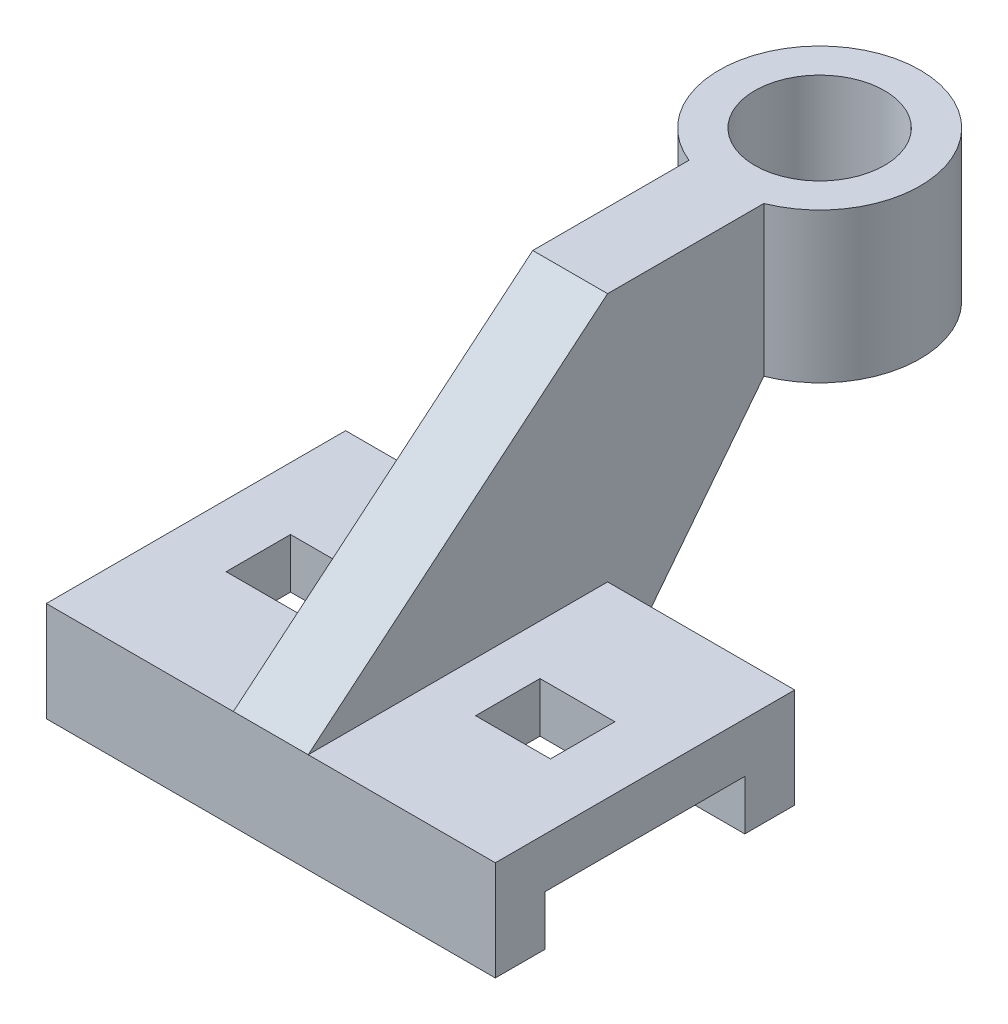
ISO-10303-21;
HEADER;
FILE_DESCRIPTION(('STEP AP214'),'2;1');
FILE_NAME('part.step','',(''),(''),'','','');
FILE_SCHEMA(('AUTOMOTIVE_DESIGN { 1 0 10303 214 1 1 1 1 }'));
ENDSEC;
DATA;
#1=APPLICATION_CONTEXT('core data for automotive mechanical design processes');
#2=APPLICATION_PROTOCOL_DEFINITION('international standard','automotive_design',2000,#1);
#3=PRODUCT_CONTEXT('',#1,'mechanical');
#4=PRODUCT('Part','Part','',(#3));
#5=PRODUCT_RELATED_PRODUCT_CATEGORY('part','',(#4));
#6=PRODUCT_DEFINITION_FORMATION('','',#4);
#7=PRODUCT_DEFINITION_CONTEXT('part definition',#1,'design');
#8=PRODUCT_DEFINITION('design','',#6,#7);
#9=PRODUCT_DEFINITION_SHAPE('','',#8);
#10=(LENGTH_UNIT() NAMED_UNIT(*) SI_UNIT(.MILLI.,.METRE.));
#11=(NAMED_UNIT(*) PLANE_ANGLE_UNIT() SI_UNIT($,.RADIAN.));
#12=(NAMED_UNIT(*) SI_UNIT($,.STERADIAN.) SOLID_ANGLE_UNIT());
#13=UNCERTAINTY_MEASURE_WITH_UNIT(LENGTH_MEASURE(1.E-05),#10,'distance_accuracy_value','');
#14=(GEOMETRIC_REPRESENTATION_CONTEXT(3) GLOBAL_UNCERTAINTY_ASSIGNED_CONTEXT((#13)) GLOBAL_UNIT_ASSIGNED_CONTEXT((#10,
#11,#12)) REPRESENTATION_CONTEXT('',''));
#15=CARTESIAN_POINT('',(0.,0.,0.));
#16=DIRECTION('',(0.,0.,1.));
#17=DIRECTION('',(1.,0.,0.));
#18=AXIS2_PLACEMENT_3D('',#15,#16,#17);
#19=CARTESIAN_POINT('',(0.,0.,0.));
#20=DIRECTION('',(0.,0.,-1.));
#21=DIRECTION('',(-1.,0.,0.));
#22=AXIS2_PLACEMENT_3D('',#19,#20,#21);
#23=PLANE('',#22);
#24=DIRECTION('',(1.,0.,0.));
#25=VECTOR('',#24,1.);
#26=CARTESIAN_POINT('',(-39.3455497382199,0.,0.));
#27=LINE('',#26,#25);
#28=CARTESIAN_POINT('',(13.1544502617801,0.,0.));
#29=VERTEX_POINT('',#28);
#30=CARTESIAN_POINT('',(50.6544502617801,0.,0.));
#31=VERTEX_POINT('',#30);
#32=EDGE_CURVE('E223',#29,#31,#27,.T.);
#33=ORIENTED_EDGE('',*,*,#32,.F.);
#34=DIRECTION('',(0.,-1.,0.));
#35=VECTOR('',#34,1.);
#36=CARTESIAN_POINT('',(13.1544502617801,47.,0.));
#37=LINE('',#36,#35);
#38=CARTESIAN_POINT('',(13.1544502617801,20.,0.));
#39=VERTEX_POINT('',#38);
#40=EDGE_CURVE('E195',#39,#29,#37,.T.);
#41=ORIENTED_EDGE('',*,*,#40,.F.);
#42=DIRECTION('',(-1.,0.,0.));
#43=VECTOR('',#42,1.);
#44=CARTESIAN_POINT('',(-39.3455497382199,20.,0.));
#45=LINE('',#44,#43);
#46=CARTESIAN_POINT('',(50.6544502617801,20.,0.));
#47=VERTEX_POINT('',#46);
#48=EDGE_CURVE('E230',#47,#39,#45,.T.);
#49=ORIENTED_EDGE('',*,*,#48,.F.);
#50=DIRECTION('',(0.,1.,0.));
#51=VECTOR('',#50,1.);
#52=CARTESIAN_POINT('',(50.6544502617801,0.,0.));
#53=LINE('',#52,#51);
#54=EDGE_CURVE('E222',#31,#47,#53,.T.);
#55=ORIENTED_EDGE('',*,*,#54,.F.);
#56=EDGE_LOOP('',(#33,#41,#49,#55));
#57=FACE_BOUND('',#56,.T.);
#58=ADVANCED_FACE('F37',(#57),#23,.T.);
#59=CARTESIAN_POINT('',(-39.3455497382199,20.,60.));
#60=DIRECTION('',(0.,-1.,0.));
#61=DIRECTION('',(0.,0.,-1.));
#62=AXIS2_PLACEMENT_3D('',#59,#60,#61);
#63=PLANE('',#62);
#64=DIRECTION('',(0.,0.,1.));
#65=VECTOR('',#64,1.);
#66=CARTESIAN_POINT('',(-11.8455497382199,20.,0.));
#67=LINE('',#66,#65);
#68=CARTESIAN_POINT('',(-11.8455497382199,20.,23.5458731665562));
#69=VERTEX_POINT('',#68);
#70=CARTESIAN_POINT('',(-11.8455497382199,20.,36.4541268334439));
#71=VERTEX_POINT('',#70);
#72=EDGE_CURVE('E60',#69,#71,#67,.T.);
#73=ORIENTED_EDGE('',*,*,#72,.T.);
#74=DIRECTION('',(1.,0.,0.));
#75=VECTOR('',#74,1.);
#76=CARTESIAN_POINT('',(0.,20.,36.4541268334439));
#77=LINE('',#76,#75);
#78=CARTESIAN_POINT('',(-26.8455497382199,20.,36.4541268334439));
#79=VERTEX_POINT('',#78);
#80=EDGE_CURVE('E289',#79,#71,#77,.T.);
#81=ORIENTED_EDGE('',*,*,#80,.F.);
#82=DIRECTION('',(0.,0.,1.));
#83=VECTOR('',#82,1.);
#84=CARTESIAN_POINT('',(-26.8455497382199,20.,0.));
#85=LINE('',#84,#83);
#86=CARTESIAN_POINT('',(-26.8455497382199,20.,23.5458731665562));
#87=VERTEX_POINT('',#86);
#88=EDGE_CURVE('E286',#87,#79,#85,.T.);
#89=ORIENTED_EDGE('',*,*,#88,.F.);
#90=DIRECTION('',(1.,0.,0.));
#91=VECTOR('',#90,1.);
#92=CARTESIAN_POINT('',(0.,20.,23.5458731665562));
#93=LINE('',#92,#91);
#94=EDGE_CURVE('E282',#87,#69,#93,.T.);
#95=ORIENTED_EDGE('',*,*,#94,.T.);
#96=EDGE_LOOP('',(#73,#81,#89,#95));
#97=FACE_BOUND('',#96,.T.);
#98=DIRECTION('',(0.,0.,1.));
#99=VECTOR('',#98,1.);
#100=CARTESIAN_POINT('',(-1.8455497382199,20.,-10.));
#101=LINE('',#100,#99);
#102=CARTESIAN_POINT('',(-1.84554973821992,20.,0.));
#103=VERTEX_POINT('',#102);
#104=CARTESIAN_POINT('',(-1.8455497382199,20.,60.));
#105=VERTEX_POINT('',#104);
#106=EDGE_CURVE('E268',#103,#105,#101,.T.);
#107=ORIENTED_EDGE('',*,*,#106,.F.);
#108=CARTESIAN_POINT('',(-39.3455497382199,20.,0.));
#109=VERTEX_POINT('',#108);
#110=EDGE_CURVE('E215',#103,#109,#45,.T.);
#111=ORIENTED_EDGE('',*,*,#110,.T.);
#112=DIRECTION('',(0.,0.,-1.));
#113=VECTOR('',#112,1.);
#114=CARTESIAN_POINT('',(-39.3455497382199,20.,60.));
#115=LINE('',#114,#113);
#116=CARTESIAN_POINT('',(-39.3455497382199,20.,60.));
#117=VERTEX_POINT('',#116);
#118=EDGE_CURVE('E234',#117,#109,#115,.T.);
#119=ORIENTED_EDGE('',*,*,#118,.F.);
#120=DIRECTION('',(-1.,0.,0.));
#121=VECTOR('',#120,1.);
#122=CARTESIAN_POINT('',(-39.3455497382199,20.,60.));
#123=LINE('',#122,#121);
#124=EDGE_CURVE('E351',#105,#117,#123,.T.);
#125=ORIENTED_EDGE('',*,*,#124,.F.);
#126=EDGE_LOOP('',(#107,#111,#119,#125));
#127=FACE_BOUND('',#126,.T.);
#128=ADVANCED_FACE('F362',(#97,#127),#63,.F.);
#129=DIRECTION('',(0.,0.,1.));
#130=VECTOR('',#129,1.);
#131=CARTESIAN_POINT('',(38.1544502617801,20.,0.));
#132=LINE('',#131,#130);
#133=CARTESIAN_POINT('',(38.1544502617801,20.,23.5458731665562));
#134=VERTEX_POINT('',#133);
#135=CARTESIAN_POINT('',(38.1544502617801,20.,36.4541268334439));
#136=VERTEX_POINT('',#135);
#137=EDGE_CURVE('E301',#134,#136,#132,.T.);
#138=ORIENTED_EDGE('',*,*,#137,.T.);
#139=DIRECTION('',(-1.,0.,0.));
#140=VECTOR('',#139,1.);
#141=CARTESIAN_POINT('',(0.,20.,36.4541268334439));
#142=LINE('',#141,#140);
#143=CARTESIAN_POINT('',(23.1544502617801,20.,36.4541268334439));
#144=VERTEX_POINT('',#143);
#145=EDGE_CURVE('E310',#136,#144,#142,.T.);
#146=ORIENTED_EDGE('',*,*,#145,.T.);
#147=DIRECTION('',(0.,0.,1.));
#148=VECTOR('',#147,1.);
#149=CARTESIAN_POINT('',(23.1544502617801,20.,0.));
#150=LINE('',#149,#148);
#151=CARTESIAN_POINT('',(23.1544502617801,20.,23.5458731665562));
#152=VERTEX_POINT('',#151);
#153=EDGE_CURVE('E307',#152,#144,#150,.T.);
#154=ORIENTED_EDGE('',*,*,#153,.F.);
#155=DIRECTION('',(-1.,0.,0.));
#156=VECTOR('',#155,1.);
#157=CARTESIAN_POINT('',(0.,20.,23.5458731665562));
#158=LINE('',#157,#156);
#159=EDGE_CURVE('E304',#134,#152,#158,.T.);
#160=ORIENTED_EDGE('',*,*,#159,.F.);
#161=EDGE_LOOP('',(#138,#146,#154,#160));
#162=FACE_BOUND('',#161,.T.);
#163=ORIENTED_EDGE('',*,*,#48,.T.);
#164=DIRECTION('',(0.,0.,1.));
#165=VECTOR('',#164,1.);
#166=CARTESIAN_POINT('',(13.1544502617801,20.,-10.));
#167=LINE('',#166,#165);
#168=CARTESIAN_POINT('',(13.1544502617801,20.,60.));
#169=VERTEX_POINT('',#168);
#170=EDGE_CURVE('E45',#39,#169,#167,.T.);
#171=ORIENTED_EDGE('',*,*,#170,.T.);
#172=CARTESIAN_POINT('',(50.6544502617801,20.,60.));
#173=VERTEX_POINT('',#172);
#174=EDGE_CURVE('E238',#173,#169,#123,.T.);
#175=ORIENTED_EDGE('',*,*,#174,.F.);
#176=DIRECTION('',(0.,0.,-1.));
#177=VECTOR('',#176,1.);
#178=CARTESIAN_POINT('',(50.6544502617801,20.,60.));
#179=LINE('',#178,#177);
#180=EDGE_CURVE('E237',#173,#47,#179,.T.);
#181=ORIENTED_EDGE('',*,*,#180,.T.);
#182=EDGE_LOOP('',(#163,#171,#175,#181));
#183=FACE_BOUND('',#182,.T.);
#184=ADVANCED_FACE('F377',(#162,#183),#63,.F.);
#185=CARTESIAN_POINT('',(-39.34554973822,10.,50.));
#186=DIRECTION('',(0.,-1.,0.));
#187=DIRECTION('',(0.,0.,-1.));
#188=AXIS2_PLACEMENT_3D('',#185,#186,#187);
#189=PLANE('',#188);
#190=DIRECTION('',(0.,0.,-1.));
#191=VECTOR('',#190,1.);
#192=CARTESIAN_POINT('',(50.6544502617801,10.,50.));
#193=LINE('',#192,#191);
#194=CARTESIAN_POINT('',(50.6544502617801,10.,50.));
#195=VERTEX_POINT('',#194);
#196=CARTESIAN_POINT('',(50.6544502617801,10.,10.));
#197=VERTEX_POINT('',#196);
#198=EDGE_CURVE('E295',#195,#197,#193,.T.);
#199=ORIENTED_EDGE('',*,*,#198,.F.);
#200=DIRECTION('',(1.,0.,0.));
#201=VECTOR('',#200,1.);
#202=CARTESIAN_POINT('',(-39.34554973822,10.,50.));
#203=LINE('',#202,#201);
#204=CARTESIAN_POINT('',(-39.34554973822,10.,50.));
#205=VERTEX_POINT('',#204);
#206=EDGE_CURVE('E329',#205,#195,#203,.T.);
#207=ORIENTED_EDGE('',*,*,#206,.F.);
#208=DIRECTION('',(0.,0.,-1.));
#209=VECTOR('',#208,1.);
#210=CARTESIAN_POINT('',(-39.34554973822,10.,50.));
#211=LINE('',#210,#209);
#212=CARTESIAN_POINT('',(-39.34554973822,10.,10.));
#213=VERTEX_POINT('',#212);
#214=EDGE_CURVE('E321',#205,#213,#211,.T.);
#215=ORIENTED_EDGE('',*,*,#214,.T.);
#216=DIRECTION('',(1.,0.,0.));
#217=VECTOR('',#216,1.);
#218=CARTESIAN_POINT('',(-39.34554973822,10.,10.));
#219=LINE('',#218,#217);
#220=EDGE_CURVE('E344',#213,#197,#219,.T.);
#221=ORIENTED_EDGE('',*,*,#220,.T.);
#222=EDGE_LOOP('',(#199,#207,#215,#221));
#223=FACE_BOUND('',#222,.T.);
#224=DIRECTION('',(1.,0.,0.));
#225=VECTOR('',#224,1.);
#226=CARTESIAN_POINT('',(-39.34554973822,10.,36.4541268334439));
#227=LINE('',#226,#225);
#228=CARTESIAN_POINT('',(23.1544502617801,10.,36.4541268334439));
#229=VERTEX_POINT('',#228);
#230=CARTESIAN_POINT('',(38.1544502617801,10.,36.4541268334439));
#231=VERTEX_POINT('',#230);
#232=EDGE_CURVE('E253',#229,#231,#227,.T.);
#233=ORIENTED_EDGE('',*,*,#232,.T.);
#234=DIRECTION('',(0.,0.,-1.));
#235=VECTOR('',#234,1.);
#236=CARTESIAN_POINT('',(38.1544502617801,10.,50.));
#237=LINE('',#236,#235);
#238=CARTESIAN_POINT('',(38.1544502617801,10.,23.5458731665562));
#239=VERTEX_POINT('',#238);
#240=EDGE_CURVE('E256',#231,#239,#237,.T.);
#241=ORIENTED_EDGE('',*,*,#240,.T.);
#242=DIRECTION('',(1.,0.,0.));
#243=VECTOR('',#242,1.);
#244=CARTESIAN_POINT('',(-39.34554973822,10.,23.5458731665562));
#245=LINE('',#244,#243);
#246=CARTESIAN_POINT('',(23.1544502617801,10.,23.5458731665562));
#247=VERTEX_POINT('',#246);
#248=EDGE_CURVE('E248',#247,#239,#245,.T.);
#249=ORIENTED_EDGE('',*,*,#248,.F.);
#250=DIRECTION('',(0.,0.,-1.));
#251=VECTOR('',#250,1.);
#252=CARTESIAN_POINT('',(23.1544502617801,10.,50.));
#253=LINE('',#252,#251);
#254=EDGE_CURVE('E250',#229,#247,#253,.T.);
#255=ORIENTED_EDGE('',*,*,#254,.F.);
#256=EDGE_LOOP('',(#233,#241,#249,#255));
#257=FACE_BOUND('',#256,.T.);
#258=DIRECTION('',(-1.,0.,0.));
#259=VECTOR('',#258,1.);
#260=CARTESIAN_POINT('',(-39.34554973822,10.,36.4541268334439));
#261=LINE('',#260,#259);
#262=CARTESIAN_POINT('',(-11.8455497382199,10.,36.4541268334439));
#263=VERTEX_POINT('',#262);
#264=CARTESIAN_POINT('',(-26.8455497382199,10.,36.4541268334439));
#265=VERTEX_POINT('',#264);
#266=EDGE_CURVE('E265',#263,#265,#261,.T.);
#267=ORIENTED_EDGE('',*,*,#266,.F.);
#268=DIRECTION('',(0.,0.,-1.));
#269=VECTOR('',#268,1.);
#270=CARTESIAN_POINT('',(-11.8455497382199,10.,50.));
#271=LINE('',#270,#269);
#272=CARTESIAN_POINT('',(-11.8455497382199,10.,23.5458731665562));
#273=VERTEX_POINT('',#272);
#274=EDGE_CURVE('E266',#263,#273,#271,.T.);
#275=ORIENTED_EDGE('',*,*,#274,.T.);
#276=DIRECTION('',(-1.,0.,0.));
#277=VECTOR('',#276,1.);
#278=CARTESIAN_POINT('',(-39.34554973822,10.,23.5458731665562));
#279=LINE('',#278,#277);
#280=CARTESIAN_POINT('',(-26.8455497382199,10.,23.5458731665562));
#281=VERTEX_POINT('',#280);
#282=EDGE_CURVE('E259',#273,#281,#279,.T.);
#283=ORIENTED_EDGE('',*,*,#282,.T.);
#284=DIRECTION('',(0.,0.,-1.));
#285=VECTOR('',#284,1.);
#286=CARTESIAN_POINT('',(-26.8455497382199,10.,50.));
#287=LINE('',#286,#285);
#288=EDGE_CURVE('E262',#265,#281,#287,.T.);
#289=ORIENTED_EDGE('',*,*,#288,.F.);
#290=EDGE_LOOP('',(#267,#275,#283,#289));
#291=FACE_BOUND('',#290,.T.);
#292=ADVANCED_FACE('F455',(#223,#257,#291),#189,.T.);
#293=CARTESIAN_POINT('',(-39.3455497382199,0.,60.));
#294=DIRECTION('',(0.,1.,0.));
#295=DIRECTION('',(0.,0.,1.));
#296=AXIS2_PLACEMENT_3D('',#293,#294,#295);
#297=PLANE('',#296);
#298=DIRECTION('',(1.,0.,0.));
#299=VECTOR('',#298,1.);
#300=CARTESIAN_POINT('',(-39.34554973822,0.,50.));
#301=LINE('',#300,#299);
#302=CARTESIAN_POINT('',(-39.34554973822,0.,50.));
#303=VERTEX_POINT('',#302);
#304=CARTESIAN_POINT('',(50.6544502617801,0.,50.));
#305=VERTEX_POINT('',#304);
#306=EDGE_CURVE('E339',#303,#305,#301,.T.);
#307=ORIENTED_EDGE('',*,*,#306,.T.);
#308=DIRECTION('',(0.,0.,-1.));
#309=VECTOR('',#308,1.);
#310=CARTESIAN_POINT('',(50.6544502617801,0.,60.));
#311=LINE('',#310,#309);
#312=CARTESIAN_POINT('',(50.6544502617801,0.,60.));
#313=VERTEX_POINT('',#312);
#314=EDGE_CURVE('E242',#313,#305,#311,.T.);
#315=ORIENTED_EDGE('',*,*,#314,.F.);
#316=DIRECTION('',(1.,0.,0.));
#317=VECTOR('',#316,1.);
#318=CARTESIAN_POINT('',(-39.3455497382199,0.,60.));
#319=LINE('',#318,#317);
#320=CARTESIAN_POINT('',(-39.3455497382199,0.,60.));
#321=VERTEX_POINT('',#320);
#322=EDGE_CURVE('E348',#321,#313,#319,.T.);
#323=ORIENTED_EDGE('',*,*,#322,.F.);
#324=DIRECTION('',(0.,0.,-1.));
#325=VECTOR('',#324,1.);
#326=CARTESIAN_POINT('',(-39.3455497382199,0.,60.));
#327=LINE('',#326,#325);
#328=EDGE_CURVE('E245',#321,#303,#327,.T.);
#329=ORIENTED_EDGE('',*,*,#328,.T.);
#330=EDGE_LOOP('',(#307,#315,#323,#329));
#331=FACE_BOUND('',#330,.T.);
#332=ADVANCED_FACE('F367',(#331),#297,.F.);
#333=CARTESIAN_POINT('',(-39.3455497382199,0.,60.));
#334=DIRECTION('',(1.,0.,0.));
#335=DIRECTION('',(0.,1.,0.));
#336=AXIS2_PLACEMENT_3D('',#333,#334,#335);
#337=PLANE('',#336);
#338=CARTESIAN_POINT('',(-39.34554973822,0.,10.));
#339=VERTEX_POINT('',#338);
#340=CARTESIAN_POINT('',(-39.3455497382199,0.,0.));
#341=VERTEX_POINT('',#340);
#342=EDGE_CURVE('E221',#339,#341,#327,.T.);
#343=ORIENTED_EDGE('',*,*,#342,.F.);
#344=DIRECTION('',(0.,1.,0.));
#345=VECTOR('',#344,1.);
#346=CARTESIAN_POINT('',(-39.34554973822,0.,10.));
#347=LINE('',#346,#345);
#348=EDGE_CURVE('E323',#339,#213,#347,.T.);
#349=ORIENTED_EDGE('',*,*,#348,.T.);
#350=ORIENTED_EDGE('',*,*,#214,.F.);
#351=DIRECTION('',(0.,1.,0.));
#352=VECTOR('',#351,1.);
#353=CARTESIAN_POINT('',(-39.34554973822,0.,50.));
#354=LINE('',#353,#352);
#355=EDGE_CURVE('E327',#303,#205,#354,.T.);
#356=ORIENTED_EDGE('',*,*,#355,.F.);
#357=ORIENTED_EDGE('',*,*,#328,.F.);
#358=DIRECTION('',(0.,-1.,0.));
#359=VECTOR('',#358,1.);
#360=CARTESIAN_POINT('',(-39.3455497382199,0.,60.));
#361=LINE('',#360,#359);
#362=EDGE_CURVE('E233',#117,#321,#361,.T.);
#363=ORIENTED_EDGE('',*,*,#362,.F.);
#364=ORIENTED_EDGE('',*,*,#118,.T.);
#365=DIRECTION('',(0.,-1.,0.));
#366=VECTOR('',#365,1.);
#367=CARTESIAN_POINT('',(-39.3455497382199,0.,0.));
#368=LINE('',#367,#366);
#369=EDGE_CURVE('E226',#109,#341,#368,.T.);
#370=ORIENTED_EDGE('',*,*,#369,.T.);
#371=EDGE_LOOP('',(#343,#349,#350,#356,#357,#363,#364,#370));
#372=FACE_BOUND('',#371,.T.);
#373=ADVANCED_FACE('F39',(#372),#337,.F.);
#374=CARTESIAN_POINT('',(-1.8455497382199,0.,0.));
#375=VERTEX_POINT('',#374);
#376=EDGE_CURVE('E213',#341,#375,#27,.T.);
#377=ORIENTED_EDGE('',*,*,#376,.T.);
#378=DIRECTION('',(1.,0.,0.));
#379=VECTOR('',#378,1.);
#380=CARTESIAN_POINT('',(-1.8455497382199,0.,0.));
#381=LINE('',#380,#379);
#382=EDGE_CURVE('E186',#375,#29,#381,.T.);
#383=ORIENTED_EDGE('',*,*,#382,.T.);
#384=ORIENTED_EDGE('',*,*,#32,.T.);
#385=CARTESIAN_POINT('',(50.6544502617801,0.,10.));
#386=VERTEX_POINT('',#385);
#387=EDGE_CURVE('E241',#386,#31,#311,.T.);
#388=ORIENTED_EDGE('',*,*,#387,.F.);
#389=DIRECTION('',(1.,0.,0.));
#390=VECTOR('',#389,1.);
#391=CARTESIAN_POINT('',(-39.34554973822,0.,10.));
#392=LINE('',#391,#390);
#393=EDGE_CURVE('E342',#339,#386,#392,.T.);
#394=ORIENTED_EDGE('',*,*,#393,.F.);
#395=ORIENTED_EDGE('',*,*,#342,.T.);
#396=EDGE_LOOP('',(#377,#383,#384,#388,#394,#395));
#397=FACE_BOUND('',#396,.T.);
#398=ADVANCED_FACE('F218',(#397),#297,.F.);
#399=CARTESIAN_POINT('',(50.6544502617801,0.,60.));
#400=DIRECTION('',(-1.,0.,0.));
#401=DIRECTION('',(0.,0.,1.));
#402=AXIS2_PLACEMENT_3D('',#399,#400,#401);
#403=PLANE('',#402);
#404=ORIENTED_EDGE('',*,*,#198,.T.);
#405=DIRECTION('',(0.,1.,0.));
#406=VECTOR('',#405,1.);
#407=CARTESIAN_POINT('',(50.6544502617801,0.,10.));
#408=LINE('',#407,#406);
#409=EDGE_CURVE('E332',#386,#197,#408,.T.);
#410=ORIENTED_EDGE('',*,*,#409,.F.);
#411=ORIENTED_EDGE('',*,*,#387,.T.);
#412=ORIENTED_EDGE('',*,*,#54,.T.);
#413=ORIENTED_EDGE('',*,*,#180,.F.);
#414=DIRECTION('',(0.,1.,0.));
#415=VECTOR('',#414,1.);
#416=CARTESIAN_POINT('',(50.6544502617801,0.,60.));
#417=LINE('',#416,#415);
#418=EDGE_CURVE('E350',#313,#173,#417,.T.);
#419=ORIENTED_EDGE('',*,*,#418,.F.);
#420=ORIENTED_EDGE('',*,*,#314,.T.);
#421=DIRECTION('',(0.,1.,0.));
#422=VECTOR('',#421,1.);
#423=CARTESIAN_POINT('',(50.6544502617801,0.,50.));
#424=LINE('',#423,#422);
#425=EDGE_CURVE('E324',#305,#195,#424,.T.);
#426=ORIENTED_EDGE('',*,*,#425,.T.);
#427=EDGE_LOOP('',(#404,#410,#411,#412,#413,#419,#420,#426));
#428=FACE_BOUND('',#427,.T.);
#429=ADVANCED_FACE('F372',(#428),#403,.F.);
#430=CARTESIAN_POINT('',(0.,0.,60.));
#431=DIRECTION('',(0.,0.,-1.));
#432=DIRECTION('',(-1.,0.,0.));
#433=AXIS2_PLACEMENT_3D('',#430,#431,#432);
#434=PLANE('',#433);
#435=ORIENTED_EDGE('',*,*,#174,.T.);
#436=DIRECTION('',(-1.,0.,0.));
#437=VECTOR('',#436,1.);
#438=CARTESIAN_POINT('',(13.1544502617801,20.,60.));
#439=LINE('',#438,#437);
#440=EDGE_CURVE('E280',#169,#105,#439,.T.);
#441=ORIENTED_EDGE('',*,*,#440,.T.);
#442=ORIENTED_EDGE('',*,*,#124,.T.);
#443=ORIENTED_EDGE('',*,*,#362,.T.);
#444=ORIENTED_EDGE('',*,*,#322,.T.);
#445=ORIENTED_EDGE('',*,*,#418,.T.);
#446=EDGE_LOOP('',(#435,#441,#442,#443,#444,#445));
#447=FACE_BOUND('',#446,.T.);
#448=ADVANCED_FACE('F358',(#447),#434,.F.);
#449=DIRECTION('',(0.,-1.,0.));
#450=VECTOR('',#449,1.);
#451=CARTESIAN_POINT('',(-1.84554973821992,47.,0.));
#452=LINE('',#451,#450);
#453=EDGE_CURVE('E202',#103,#375,#452,.T.);
#454=ORIENTED_EDGE('',*,*,#453,.T.);
#455=ORIENTED_EDGE('',*,*,#376,.F.);
#456=ORIENTED_EDGE('',*,*,#369,.F.);
#457=ORIENTED_EDGE('',*,*,#110,.F.);
#458=EDGE_LOOP('',(#454,#455,#456,#457));
#459=FACE_BOUND('',#458,.T.);
#460=ADVANCED_FACE('F211',(#459),#23,.T.);
#461=CARTESIAN_POINT('',(-39.34554973822,0.,10.));
#462=DIRECTION('',(0.,0.,-1.));
#463=DIRECTION('',(-1.,0.,0.));
#464=AXIS2_PLACEMENT_3D('',#461,#462,#463);
#465=PLANE('',#464);
#466=ORIENTED_EDGE('',*,*,#409,.T.);
#467=ORIENTED_EDGE('',*,*,#220,.F.);
#468=ORIENTED_EDGE('',*,*,#348,.F.);
#469=ORIENTED_EDGE('',*,*,#393,.T.);
#470=EDGE_LOOP('',(#466,#467,#468,#469));
#471=FACE_BOUND('',#470,.T.);
#472=ADVANCED_FACE('F442',(#471),#465,.F.);
#473=CARTESIAN_POINT('',(-39.34554973822,0.,50.));
#474=DIRECTION('',(0.,0.,-1.));
#475=DIRECTION('',(-1.,0.,0.));
#476=AXIS2_PLACEMENT_3D('',#473,#474,#475);
#477=PLANE('',#476);
#478=ORIENTED_EDGE('',*,*,#425,.F.);
#479=ORIENTED_EDGE('',*,*,#306,.F.);
#480=ORIENTED_EDGE('',*,*,#355,.T.);
#481=ORIENTED_EDGE('',*,*,#206,.T.);
#482=EDGE_LOOP('',(#478,#479,#480,#481));
#483=FACE_BOUND('',#482,.T.);
#484=ADVANCED_FACE('F447',(#483),#477,.T.);
#485=CARTESIAN_POINT('',(38.1544502617801,-10.,0.));
#486=DIRECTION('',(-1.,0.,0.));
#487=DIRECTION('',(0.,0.,1.));
#488=AXIS2_PLACEMENT_3D('',#485,#486,#487);
#489=PLANE('',#488);
#490=DIRECTION('',(0.,1.,0.));
#491=VECTOR('',#490,1.);
#492=CARTESIAN_POINT('',(38.1544502617801,-10.,36.4541268334439));
#493=LINE('',#492,#491);
#494=EDGE_CURVE('E283',#231,#136,#493,.T.);
#495=ORIENTED_EDGE('',*,*,#494,.T.);
#496=ORIENTED_EDGE('',*,*,#137,.F.);
#497=DIRECTION('',(0.,1.,0.));
#498=VECTOR('',#497,1.);
#499=CARTESIAN_POINT('',(38.1544502617801,-10.,23.5458731665562));
#500=LINE('',#499,#498);
#501=EDGE_CURVE('E313',#239,#134,#500,.T.);
#502=ORIENTED_EDGE('',*,*,#501,.F.);
#503=ORIENTED_EDGE('',*,*,#240,.F.);
#504=EDGE_LOOP('',(#495,#496,#502,#503));
#505=FACE_BOUND('',#504,.T.);
#506=ADVANCED_FACE('F461',(#505),#489,.T.);
#507=CARTESIAN_POINT('',(0.,-10.,36.4541268334439));
#508=DIRECTION('',(0.,0.,-1.));
#509=DIRECTION('',(-1.,0.,0.));
#510=AXIS2_PLACEMENT_3D('',#507,#508,#509);
#511=PLANE('',#510);
#512=DIRECTION('',(0.,1.,0.));
#513=VECTOR('',#512,1.);
#514=CARTESIAN_POINT('',(23.1544502617801,-10.,36.4541268334439));
#515=LINE('',#514,#513);
#516=EDGE_CURVE('E315',#229,#144,#515,.T.);
#517=ORIENTED_EDGE('',*,*,#516,.T.);
#518=ORIENTED_EDGE('',*,*,#145,.F.);
#519=ORIENTED_EDGE('',*,*,#494,.F.);
#520=ORIENTED_EDGE('',*,*,#232,.F.);
#521=EDGE_LOOP('',(#517,#518,#519,#520));
#522=FACE_BOUND('',#521,.T.);
#523=ADVANCED_FACE('F465',(#522),#511,.T.);
#524=CARTESIAN_POINT('',(23.1544502617801,-10.,0.));
#525=DIRECTION('',(-1.,0.,0.));
#526=DIRECTION('',(0.,0.,1.));
#527=AXIS2_PLACEMENT_3D('',#524,#525,#526);
#528=PLANE('',#527);
#529=ORIENTED_EDGE('',*,*,#254,.T.);
#530=DIRECTION('',(0.,1.,0.));
#531=VECTOR('',#530,1.);
#532=CARTESIAN_POINT('',(23.1544502617801,-10.,23.5458731665562));
#533=LINE('',#532,#531);
#534=EDGE_CURVE('E317',#247,#152,#533,.T.);
#535=ORIENTED_EDGE('',*,*,#534,.T.);
#536=ORIENTED_EDGE('',*,*,#153,.T.);
#537=ORIENTED_EDGE('',*,*,#516,.F.);
#538=EDGE_LOOP('',(#529,#535,#536,#537));
#539=FACE_BOUND('',#538,.T.);
#540=ADVANCED_FACE('F471',(#539),#528,.F.);
#541=CARTESIAN_POINT('',(0.,-10.,23.5458731665562));
#542=DIRECTION('',(0.,0.,-1.));
#543=DIRECTION('',(-1.,0.,0.));
#544=AXIS2_PLACEMENT_3D('',#541,#542,#543);
#545=PLANE('',#544);
#546=ORIENTED_EDGE('',*,*,#248,.T.);
#547=ORIENTED_EDGE('',*,*,#501,.T.);
#548=ORIENTED_EDGE('',*,*,#159,.T.);
#549=ORIENTED_EDGE('',*,*,#534,.F.);
#550=EDGE_LOOP('',(#546,#547,#548,#549));
#551=FACE_BOUND('',#550,.T.);
#552=ADVANCED_FACE('F467',(#551),#545,.F.);
#553=CARTESIAN_POINT('',(-11.8455497382199,-10.,0.));
#554=DIRECTION('',(-1.,0.,0.));
#555=DIRECTION('',(0.,0.,1.));
#556=AXIS2_PLACEMENT_3D('',#553,#554,#555);
#557=PLANE('',#556);
#558=DIRECTION('',(0.,1.,0.));
#559=VECTOR('',#558,1.);
#560=CARTESIAN_POINT('',(-11.8455497382199,-10.,36.4541268334439));
#561=LINE('',#560,#559);
#562=EDGE_CURVE('E293',#263,#71,#561,.T.);
#563=ORIENTED_EDGE('',*,*,#562,.T.);
#564=ORIENTED_EDGE('',*,*,#72,.F.);
#565=DIRECTION('',(0.,1.,0.));
#566=VECTOR('',#565,1.);
#567=CARTESIAN_POINT('',(-11.8455497382199,-10.,23.5458731665562));
#568=LINE('',#567,#566);
#569=EDGE_CURVE('E292',#273,#69,#568,.T.);
#570=ORIENTED_EDGE('',*,*,#569,.F.);
#571=ORIENTED_EDGE('',*,*,#274,.F.);
#572=EDGE_LOOP('',(#563,#564,#570,#571));
#573=FACE_BOUND('',#572,.T.);
#574=ADVANCED_FACE('F470',(#573),#557,.T.);
#575=CARTESIAN_POINT('',(0.,-10.,36.4541268334439));
#576=DIRECTION('',(0.,0.,1.));
#577=DIRECTION('',(1.,0.,0.));
#578=AXIS2_PLACEMENT_3D('',#575,#576,#577);
#579=PLANE('',#578);
#580=ORIENTED_EDGE('',*,*,#266,.T.);
#581=DIRECTION('',(0.,1.,0.));
#582=VECTOR('',#581,1.);
#583=CARTESIAN_POINT('',(-26.8455497382199,-10.,36.4541268334439));
#584=LINE('',#583,#582);
#585=EDGE_CURVE('E296',#265,#79,#584,.T.);
#586=ORIENTED_EDGE('',*,*,#585,.T.);
#587=ORIENTED_EDGE('',*,*,#80,.T.);
#588=ORIENTED_EDGE('',*,*,#562,.F.);
#589=EDGE_LOOP('',(#580,#586,#587,#588));
#590=FACE_BOUND('',#589,.T.);
#591=ADVANCED_FACE('F480',(#590),#579,.F.);
#592=CARTESIAN_POINT('',(-26.8455497382199,-10.,0.));
#593=DIRECTION('',(-1.,0.,0.));
#594=DIRECTION('',(0.,0.,1.));
#595=AXIS2_PLACEMENT_3D('',#592,#593,#594);
#596=PLANE('',#595);
#597=ORIENTED_EDGE('',*,*,#288,.T.);
#598=DIRECTION('',(0.,1.,0.));
#599=VECTOR('',#598,1.);
#600=CARTESIAN_POINT('',(-26.8455497382199,-10.,23.5458731665562));
#601=LINE('',#600,#599);
#602=EDGE_CURVE('E298',#281,#87,#601,.T.);
#603=ORIENTED_EDGE('',*,*,#602,.T.);
#604=ORIENTED_EDGE('',*,*,#88,.T.);
#605=ORIENTED_EDGE('',*,*,#585,.F.);
#606=EDGE_LOOP('',(#597,#603,#604,#605));
#607=FACE_BOUND('',#606,.T.);
#608=ADVANCED_FACE('F427',(#607),#596,.F.);
#609=CARTESIAN_POINT('',(0.,-10.,23.5458731665562));
#610=DIRECTION('',(0.,0.,1.));
#611=DIRECTION('',(1.,0.,0.));
#612=AXIS2_PLACEMENT_3D('',#609,#610,#611);
#613=PLANE('',#612);
#614=ORIENTED_EDGE('',*,*,#569,.T.);
#615=ORIENTED_EDGE('',*,*,#94,.F.);
#616=ORIENTED_EDGE('',*,*,#602,.F.);
#617=ORIENTED_EDGE('',*,*,#282,.F.);
#618=EDGE_LOOP('',(#614,#615,#616,#617));
#619=FACE_BOUND('',#618,.T.);
#620=ADVANCED_FACE('F419',(#619),#613,.T.);
#621=CARTESIAN_POINT('',(13.1544502617801,70.0292954584751,-10.));
#622=DIRECTION('',(0.,1.,0.));
#623=DIRECTION('',(0.,0.,1.));
#624=AXIS2_PLACEMENT_3D('',#621,#622,#623);
#625=PLANE('',#624);
#626=DIRECTION('',(-1.,0.,0.));
#627=VECTOR('',#626,1.);
#628=CARTESIAN_POINT('',(13.1544502617801,70.0292954584751,0.));
#629=LINE('',#628,#627);
#630=CARTESIAN_POINT('',(13.1544502617801,70.0292954584751,0.));
#631=VERTEX_POINT('',#630);
#632=CARTESIAN_POINT('',(-1.8455497382199,70.0292954584751,0.));
#633=VERTEX_POINT('',#632);
#634=EDGE_CURVE('E52',#631,#633,#629,.T.);
#635=ORIENTED_EDGE('',*,*,#634,.F.);
#636=DIRECTION('',(0.,0.,1.));
#637=VECTOR('',#636,1.);
#638=CARTESIAN_POINT('',(13.1544502617801,70.0292954584751,-10.));
#639=LINE('',#638,#637);
#640=CARTESIAN_POINT('',(13.1544502617801,70.0292954584751,-31.3120877493182));
#641=VERTEX_POINT('',#640);
#642=EDGE_CURVE('E279',#641,#631,#639,.T.);
#643=ORIENTED_EDGE('',*,*,#642,.F.);
#644=CARTESIAN_POINT('',(5.6544502617801,70.0292954584751,-50.));
#645=DIRECTION('',(0.,1.,0.));
#646=DIRECTION('',(0.,0.,1.));
#647=AXIS2_PLACEMENT_3D('',#644,#645,#646);
#648=CIRCLE('',#647,20.1367342011852);
#649=CARTESIAN_POINT('',(-1.84554973821991,70.0292954584751,-31.3120877493182));
#650=VERTEX_POINT('',#649);
#651=EDGE_CURVE('E396',#641,#650,#648,.T.);
#652=ORIENTED_EDGE('',*,*,#651,.T.);
#653=DIRECTION('',(0.,0.,1.));
#654=VECTOR('',#653,1.);
#655=CARTESIAN_POINT('',(-1.8455497382199,70.0292954584751,-10.));
#656=LINE('',#655,#654);
#657=EDGE_CURVE('E276',#650,#633,#656,.T.);
#658=ORIENTED_EDGE('',*,*,#657,.T.);
#659=EDGE_LOOP('',(#635,#643,#652,#658));
#660=FACE_BOUND('',#659,.T.);
#661=CARTESIAN_POINT('',(5.6544502617801,70.0292954584751,-50.));
#662=DIRECTION('',(0.,1.,0.));
#663=DIRECTION('',(0.,0.,1.));
#664=AXIS2_PLACEMENT_3D('',#661,#662,#663);
#665=CIRCLE('',#664,13.);
#666=CARTESIAN_POINT('',(5.6544502617801,70.0292954584751,-37.));
#667=VERTEX_POINT('',#666);
#668=EDGE_CURVE('E216',#667,#667,#665,.T.);
#669=ORIENTED_EDGE('',*,*,#668,.F.);
#670=EDGE_LOOP('',(#669));
#671=FACE_BOUND('',#670,.T.);
#672=ADVANCED_FACE('F417',(#660,#671),#625,.T.);
#673=CARTESIAN_POINT('',(13.1544502617801,20.,-10.));
#674=DIRECTION('',(1.,0.,0.));
#675=DIRECTION('',(0.,0.,-1.));
#676=AXIS2_PLACEMENT_3D('',#673,#674,#675);
#677=PLANE('',#676);
#678=DIRECTION('',(0.,-0.787650015738369,0.616122920128238));
#679=VECTOR('',#678,1.);
#680=CARTESIAN_POINT('',(13.1544502617801,40.0292954584751,-31.3120877493182));
#681=LINE('',#680,#679);
#682=CARTESIAN_POINT('',(13.1544502617801,40.0292954584751,-31.3120877493182));
#683=VERTEX_POINT('',#682);
#684=EDGE_CURVE('E191',#683,#29,#681,.T.);
#685=ORIENTED_EDGE('',*,*,#684,.F.);
#686=DIRECTION('',(0.,1.,0.));
#687=VECTOR('',#686,1.);
#688=CARTESIAN_POINT('',(13.1544502617801,40.0292954584751,-31.3120877493182));
#689=LINE('',#688,#687);
#690=EDGE_CURVE('E391',#683,#641,#689,.T.);
#691=ORIENTED_EDGE('',*,*,#690,.T.);
#692=ORIENTED_EDGE('',*,*,#642,.T.);
#693=DIRECTION('',(0.,-0.640405684484523,0.768036821565158));
#694=VECTOR('',#693,1.);
#695=CARTESIAN_POINT('',(13.1544502617801,70.0292954584751,0.));
#696=LINE('',#695,#694);
#697=EDGE_CURVE('E384',#631,#169,#696,.T.);
#698=ORIENTED_EDGE('',*,*,#697,.T.);
#699=ORIENTED_EDGE('',*,*,#170,.F.);
#700=ORIENTED_EDGE('',*,*,#40,.T.);
#701=EDGE_LOOP('',(#685,#691,#692,#698,#699,#700));
#702=FACE_BOUND('',#701,.T.);
#703=ADVANCED_FACE('F381',(#702),#677,.T.);
#704=CARTESIAN_POINT('',(-1.8455497382199,20.,-10.));
#705=DIRECTION('',(1.,0.,0.));
#706=DIRECTION('',(0.,0.,-1.));
#707=AXIS2_PLACEMENT_3D('',#704,#705,#706);
#708=PLANE('',#707);
#709=DIRECTION('',(0.,1.,0.));
#710=VECTOR('',#709,1.);
#711=CARTESIAN_POINT('',(-1.84554973821991,40.0292954584751,-31.3120877493182));
#712=LINE('',#711,#710);
#713=CARTESIAN_POINT('',(-1.84554973821992,40.0292954584751,-31.3120877493182));
#714=VERTEX_POINT('',#713);
#715=EDGE_CURVE('E205',#714,#650,#712,.T.);
#716=ORIENTED_EDGE('',*,*,#715,.F.);
#717=DIRECTION('',(0.,-0.787650015738369,0.616122920128238));
#718=VECTOR('',#717,1.);
#719=CARTESIAN_POINT('',(-1.8455497382199,40.0292954584751,-31.3120877493182));
#720=LINE('',#719,#718);
#721=EDGE_CURVE('E189',#714,#375,#720,.T.);
#722=ORIENTED_EDGE('',*,*,#721,.T.);
#723=ORIENTED_EDGE('',*,*,#453,.F.);
#724=ORIENTED_EDGE('',*,*,#106,.T.);
#725=DIRECTION('',(0.,-0.640405684484523,0.768036821565158));
#726=VECTOR('',#725,1.);
#727=CARTESIAN_POINT('',(-1.8455497382199,70.0292954584751,0.));
#728=LINE('',#727,#726);
#729=EDGE_CURVE('E386',#633,#105,#728,.T.);
#730=ORIENTED_EDGE('',*,*,#729,.F.);
#731=ORIENTED_EDGE('',*,*,#657,.F.);
#732=EDGE_LOOP('',(#716,#722,#723,#724,#730,#731));
#733=FACE_BOUND('',#732,.T.);
#734=ADVANCED_FACE('F200',(#733),#708,.F.);
#735=CARTESIAN_POINT('',(13.1544502617801,70.0292954584751,0.));
#736=DIRECTION('',(0.,-0.768036821565158,-0.640405684484523));
#737=DIRECTION('',(0.,0.640405684484523,-0.768036821565158));
#738=AXIS2_PLACEMENT_3D('',#735,#736,#737);
#739=PLANE('',#738);
#740=ORIENTED_EDGE('',*,*,#729,.T.);
#741=ORIENTED_EDGE('',*,*,#440,.F.);
#742=ORIENTED_EDGE('',*,*,#697,.F.);
#743=ORIENTED_EDGE('',*,*,#634,.T.);
#744=EDGE_LOOP('',(#740,#741,#742,#743));
#745=FACE_BOUND('',#744,.T.);
#746=ADVANCED_FACE('F517',(#745),#739,.F.);
#747=CARTESIAN_POINT('',(5.6544502617801,40.0292954584751,-50.));
#748=DIRECTION('',(0.,1.,0.));
#749=DIRECTION('',(0.,0.,1.));
#750=AXIS2_PLACEMENT_3D('',#747,#748,#749);
#751=CYLINDRICAL_SURFACE('',#750,20.1367342011852);
#752=ORIENTED_EDGE('',*,*,#651,.F.);
#753=ORIENTED_EDGE('',*,*,#690,.F.);
#754=CARTESIAN_POINT('',(5.6544502617801,40.0292954584751,-50.));
#755=DIRECTION('',(0.,1.,0.));
#756=DIRECTION('',(0.,0.,1.));
#757=AXIS2_PLACEMENT_3D('',#754,#755,#756);
#758=CIRCLE('',#757,20.1367342011852);
#759=EDGE_CURVE('E394',#683,#714,#758,.T.);
#760=ORIENTED_EDGE('',*,*,#759,.T.);
#761=ORIENTED_EDGE('',*,*,#715,.T.);
#762=EDGE_LOOP('',(#752,#753,#760,#761));
#763=FACE_BOUND('',#762,.T.);
#764=ADVANCED_FACE('F521',(#763),#751,.T.);
#765=CARTESIAN_POINT('',(5.6544502617801,40.0292954584751,-50.));
#766=DIRECTION('',(0.,1.,0.));
#767=DIRECTION('',(0.,0.,1.));
#768=AXIS2_PLACEMENT_3D('',#765,#766,#767);
#769=PLANE('',#768);
#770=CARTESIAN_POINT('',(5.6544502617801,40.0292954584751,-50.));
#771=DIRECTION('',(0.,1.,0.));
#772=DIRECTION('',(0.,0.,1.));
#773=AXIS2_PLACEMENT_3D('',#770,#771,#772);
#774=CIRCLE('',#773,13.);
#775=CARTESIAN_POINT('',(5.6544502617801,40.0292954584751,-37.));
#776=VERTEX_POINT('',#775);
#777=EDGE_CURVE('E399',#776,#776,#774,.T.);
#778=ORIENTED_EDGE('',*,*,#777,.T.);
#779=EDGE_LOOP('',(#778));
#780=FACE_BOUND('',#779,.T.);
#781=ORIENTED_EDGE('',*,*,#759,.F.);
#782=DIRECTION('',(-1.,0.,0.));
#783=VECTOR('',#782,1.);
#784=CARTESIAN_POINT('',(5.6544502617801,40.0292954584751,-31.3120877493182));
#785=LINE('',#784,#783);
#786=EDGE_CURVE('E11',#683,#714,#785,.T.);
#787=ORIENTED_EDGE('',*,*,#786,.T.);
#788=EDGE_LOOP('',(#781,#787));
#789=FACE_BOUND('',#788,.T.);
#790=ADVANCED_FACE('F408',(#780,#789),#769,.F.);
#791=CARTESIAN_POINT('',(5.6544502617801,40.0292954584751,-50.));
#792=DIRECTION('',(0.,1.,0.));
#793=DIRECTION('',(0.,0.,1.));
#794=AXIS2_PLACEMENT_3D('',#791,#792,#793);
#795=CYLINDRICAL_SURFACE('',#794,13.);
#796=ORIENTED_EDGE('',*,*,#777,.F.);
#797=EDGE_LOOP('',(#796));
#798=FACE_BOUND('',#797,.T.);
#799=ORIENTED_EDGE('',*,*,#668,.T.);
#800=EDGE_LOOP('',(#799));
#801=FACE_BOUND('',#800,.T.);
#802=ADVANCED_FACE('F411',(#798,#801),#795,.F.);
#803=CARTESIAN_POINT('',(-1.8455497382199,40.0292954584751,-31.3120877493182));
#804=DIRECTION('',(0.,0.616122920128238,0.787650015738369));
#805=DIRECTION('',(0.,-0.787650015738369,0.616122920128238));
#806=AXIS2_PLACEMENT_3D('',#803,#804,#805);
#807=PLANE('',#806);
#808=ORIENTED_EDGE('',*,*,#684,.T.);
#809=ORIENTED_EDGE('',*,*,#382,.F.);
#810=ORIENTED_EDGE('',*,*,#721,.F.);
#811=ORIENTED_EDGE('',*,*,#786,.F.);
#812=EDGE_LOOP('',(#808,#809,#810,#811));
#813=FACE_BOUND('',#812,.T.);
#814=ADVANCED_FACE('F188',(#813),#807,.F.);
#815=CLOSED_SHELL('',(#58,#128,#184,#292,#332,#373,#398,#429,#448,#460,#472,#484,#506,#523,#540,
#552,#574,#591,#608,#620,#672,#703,#734,#746,#764,#790,#802,#814));
#816=MANIFOLD_SOLID_BREP('B2',#815);
#817=ADVANCED_BREP_SHAPE_REPRESENTATION('',(#18,#816),#14);
#818=SHAPE_DEFINITION_REPRESENTATION(#9,#817);
ENDSEC;
END-ISO-10303-21;
